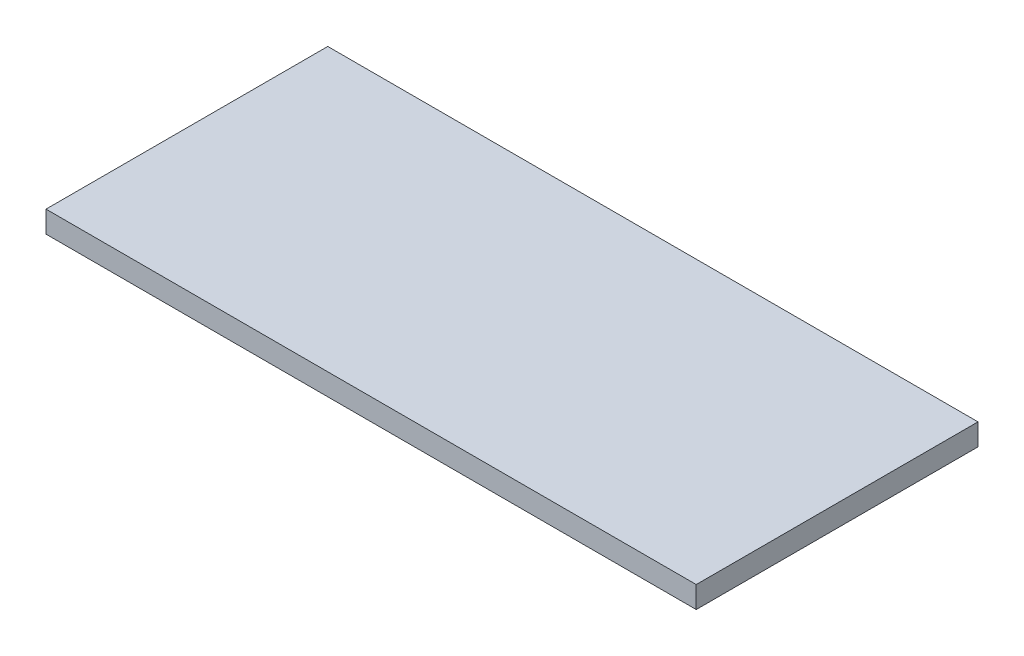
ISO-10303-21;
HEADER;
FILE_DESCRIPTION(('STEP AP214'),'2;1');
FILE_NAME('part.step','',(''),(''),'','','');
FILE_SCHEMA(('AUTOMOTIVE_DESIGN { 1 0 10303 214 1 1 1 1 }'));
ENDSEC;
DATA;
#1=APPLICATION_CONTEXT('core data for automotive mechanical design processes');
#2=APPLICATION_PROTOCOL_DEFINITION('international standard','automotive_design',2000,#1);
#3=PRODUCT_CONTEXT('',#1,'mechanical');
#4=PRODUCT('Part','Part','',(#3));
#5=PRODUCT_RELATED_PRODUCT_CATEGORY('part','',(#4));
#6=PRODUCT_DEFINITION_FORMATION('','',#4);
#7=PRODUCT_DEFINITION_CONTEXT('part definition',#1,'design');
#8=PRODUCT_DEFINITION('design','',#6,#7);
#9=PRODUCT_DEFINITION_SHAPE('','',#8);
#10=(LENGTH_UNIT() NAMED_UNIT(*) SI_UNIT(.MILLI.,.METRE.));
#11=(NAMED_UNIT(*) PLANE_ANGLE_UNIT() SI_UNIT($,.RADIAN.));
#12=(NAMED_UNIT(*) SI_UNIT($,.STERADIAN.) SOLID_ANGLE_UNIT());
#13=UNCERTAINTY_MEASURE_WITH_UNIT(LENGTH_MEASURE(1.E-05),#10,'distance_accuracy_value','');
#14=(GEOMETRIC_REPRESENTATION_CONTEXT(3) GLOBAL_UNCERTAINTY_ASSIGNED_CONTEXT((#13)) GLOBAL_UNIT_ASSIGNED_CONTEXT((#10,
#11,#12)) REPRESENTATION_CONTEXT('',''));
#15=CARTESIAN_POINT('',(0.,0.,0.));
#16=DIRECTION('',(0.,0.,1.));
#17=DIRECTION('',(1.,0.,0.));
#18=AXIS2_PLACEMENT_3D('',#15,#16,#17);
#19=CARTESIAN_POINT('',(750.,50.,325.));
#20=DIRECTION('',(-1.,0.,0.));
#21=DIRECTION('',(0.,0.,1.));
#22=AXIS2_PLACEMENT_3D('',#19,#20,#21);
#23=PLANE('',#22);
#24=DIRECTION('',(0.,0.,-1.));
#25=VECTOR('',#24,1.);
#26=CARTESIAN_POINT('',(750.,0.,325.));
#27=LINE('',#26,#25);
#28=CARTESIAN_POINT('',(750.,0.,325.));
#29=VERTEX_POINT('',#28);
#30=CARTESIAN_POINT('',(750.,0.,-325.));
#31=VERTEX_POINT('',#30);
#32=EDGE_CURVE('E96',#29,#31,#27,.T.);
#33=ORIENTED_EDGE('',*,*,#32,.T.);
#34=DIRECTION('',(0.,-1.,0.));
#35=VECTOR('',#34,1.);
#36=CARTESIAN_POINT('',(750.,50.,-325.));
#37=LINE('',#36,#35);
#38=CARTESIAN_POINT('',(750.,50.,-325.));
#39=VERTEX_POINT('',#38);
#40=EDGE_CURVE('E11',#39,#31,#37,.T.);
#41=ORIENTED_EDGE('',*,*,#40,.F.);
#42=DIRECTION('',(0.,0.,-1.));
#43=VECTOR('',#42,1.);
#44=CARTESIAN_POINT('',(750.,50.,325.));
#45=LINE('',#44,#43);
#46=CARTESIAN_POINT('',(750.,50.,325.));
#47=VERTEX_POINT('',#46);
#48=EDGE_CURVE('E84',#47,#39,#45,.T.);
#49=ORIENTED_EDGE('',*,*,#48,.F.);
#50=DIRECTION('',(0.,-1.,0.));
#51=VECTOR('',#50,1.);
#52=CARTESIAN_POINT('',(750.,50.,325.));
#53=LINE('',#52,#51);
#54=EDGE_CURVE('E92',#47,#29,#53,.T.);
#55=ORIENTED_EDGE('',*,*,#54,.T.);
#56=EDGE_LOOP('',(#33,#41,#49,#55));
#57=FACE_BOUND('',#56,.T.);
#58=ADVANCED_FACE('F33',(#57),#23,.F.);
#59=CARTESIAN_POINT('',(-750.,50.,-325.));
#60=DIRECTION('',(0.,0.,1.));
#61=DIRECTION('',(1.,0.,0.));
#62=AXIS2_PLACEMENT_3D('',#59,#60,#61);
#63=PLANE('',#62);
#64=DIRECTION('',(-1.,0.,0.));
#65=VECTOR('',#64,1.);
#66=CARTESIAN_POINT('',(-750.,0.,-325.));
#67=LINE('',#66,#65);
#68=CARTESIAN_POINT('',(-750.,0.,-325.));
#69=VERTEX_POINT('',#68);
#70=EDGE_CURVE('E88',#31,#69,#67,.T.);
#71=ORIENTED_EDGE('',*,*,#70,.T.);
#72=DIRECTION('',(0.,-1.,0.));
#73=VECTOR('',#72,1.);
#74=CARTESIAN_POINT('',(-750.,50.,-325.));
#75=LINE('',#74,#73);
#76=CARTESIAN_POINT('',(-750.,50.,-325.));
#77=VERTEX_POINT('',#76);
#78=EDGE_CURVE('E41',#77,#69,#75,.T.);
#79=ORIENTED_EDGE('',*,*,#78,.F.);
#80=DIRECTION('',(-1.,0.,0.));
#81=VECTOR('',#80,1.);
#82=CARTESIAN_POINT('',(-750.,50.,-325.));
#83=LINE('',#82,#81);
#84=EDGE_CURVE('E79',#39,#77,#83,.T.);
#85=ORIENTED_EDGE('',*,*,#84,.F.);
#86=ORIENTED_EDGE('',*,*,#40,.T.);
#87=EDGE_LOOP('',(#71,#79,#85,#86));
#88=FACE_BOUND('',#87,.T.);
#89=ADVANCED_FACE('F87',(#88),#63,.F.);
#90=CARTESIAN_POINT('',(-750.,50.,325.));
#91=DIRECTION('',(1.,0.,0.));
#92=DIRECTION('',(0.,0.,-1.));
#93=AXIS2_PLACEMENT_3D('',#90,#91,#92);
#94=PLANE('',#93);
#95=DIRECTION('',(0.,0.,1.));
#96=VECTOR('',#95,1.);
#97=CARTESIAN_POINT('',(-750.,0.,325.));
#98=LINE('',#97,#96);
#99=CARTESIAN_POINT('',(-750.,0.,325.));
#100=VERTEX_POINT('',#99);
#101=EDGE_CURVE('E66',#69,#100,#98,.T.);
#102=ORIENTED_EDGE('',*,*,#101,.T.);
#103=DIRECTION('',(0.,-1.,0.));
#104=VECTOR('',#103,1.);
#105=CARTESIAN_POINT('',(-750.,50.,325.));
#106=LINE('',#105,#104);
#107=CARTESIAN_POINT('',(-750.,50.,325.));
#108=VERTEX_POINT('',#107);
#109=EDGE_CURVE('E89',#108,#100,#106,.T.);
#110=ORIENTED_EDGE('',*,*,#109,.F.);
#111=DIRECTION('',(0.,0.,1.));
#112=VECTOR('',#111,1.);
#113=CARTESIAN_POINT('',(-750.,50.,325.));
#114=LINE('',#113,#112);
#115=EDGE_CURVE('E82',#77,#108,#114,.T.);
#116=ORIENTED_EDGE('',*,*,#115,.F.);
#117=ORIENTED_EDGE('',*,*,#78,.T.);
#118=EDGE_LOOP('',(#102,#110,#116,#117));
#119=FACE_BOUND('',#118,.T.);
#120=ADVANCED_FACE('F90',(#119),#94,.F.);
#121=CARTESIAN_POINT('',(-750.,50.,325.));
#122=DIRECTION('',(0.,0.,-1.));
#123=DIRECTION('',(-1.,0.,0.));
#124=AXIS2_PLACEMENT_3D('',#121,#122,#123);
#125=PLANE('',#124);
#126=DIRECTION('',(1.,0.,0.));
#127=VECTOR('',#126,1.);
#128=CARTESIAN_POINT('',(-750.,0.,325.));
#129=LINE('',#128,#127);
#130=EDGE_CURVE('E72',#100,#29,#129,.T.);
#131=ORIENTED_EDGE('',*,*,#130,.T.);
#132=ORIENTED_EDGE('',*,*,#54,.F.);
#133=DIRECTION('',(1.,0.,0.));
#134=VECTOR('',#133,1.);
#135=CARTESIAN_POINT('',(-750.,50.,325.));
#136=LINE('',#135,#134);
#137=EDGE_CURVE('E49',#108,#47,#136,.T.);
#138=ORIENTED_EDGE('',*,*,#137,.F.);
#139=ORIENTED_EDGE('',*,*,#109,.T.);
#140=EDGE_LOOP('',(#131,#132,#138,#139));
#141=FACE_BOUND('',#140,.T.);
#142=ADVANCED_FACE('F103',(#141),#125,.F.);
#143=CARTESIAN_POINT('',(0.,50.,0.));
#144=DIRECTION('',(0.,-1.,0.));
#145=DIRECTION('',(0.,0.,-1.));
#146=AXIS2_PLACEMENT_3D('',#143,#144,#145);
#147=PLANE('',#146);
#148=ORIENTED_EDGE('',*,*,#48,.T.);
#149=ORIENTED_EDGE('',*,*,#84,.T.);
#150=ORIENTED_EDGE('',*,*,#115,.T.);
#151=ORIENTED_EDGE('',*,*,#137,.T.);
#152=EDGE_LOOP('',(#148,#149,#150,#151));
#153=FACE_BOUND('',#152,.T.);
#154=ADVANCED_FACE('F80',(#153),#147,.F.);
#155=CARTESIAN_POINT('',(0.,0.,0.));
#156=DIRECTION('',(0.,-1.,0.));
#157=DIRECTION('',(0.,0.,-1.));
#158=AXIS2_PLACEMENT_3D('',#155,#156,#157);
#159=PLANE('',#158);
#160=ORIENTED_EDGE('',*,*,#32,.F.);
#161=ORIENTED_EDGE('',*,*,#130,.F.);
#162=ORIENTED_EDGE('',*,*,#101,.F.);
#163=ORIENTED_EDGE('',*,*,#70,.F.);
#164=EDGE_LOOP('',(#160,#161,#162,#163));
#165=FACE_BOUND('',#164,.T.);
#166=ADVANCED_FACE('F106',(#165),#159,.T.);
#167=CLOSED_SHELL('',(#58,#89,#120,#142,#154,#166));
#168=MANIFOLD_SOLID_BREP('B2',#167);
#169=ADVANCED_BREP_SHAPE_REPRESENTATION('',(#18,#168),#14);
#170=SHAPE_DEFINITION_REPRESENTATION(#9,#169);
ENDSEC;
END-ISO-10303-21;
